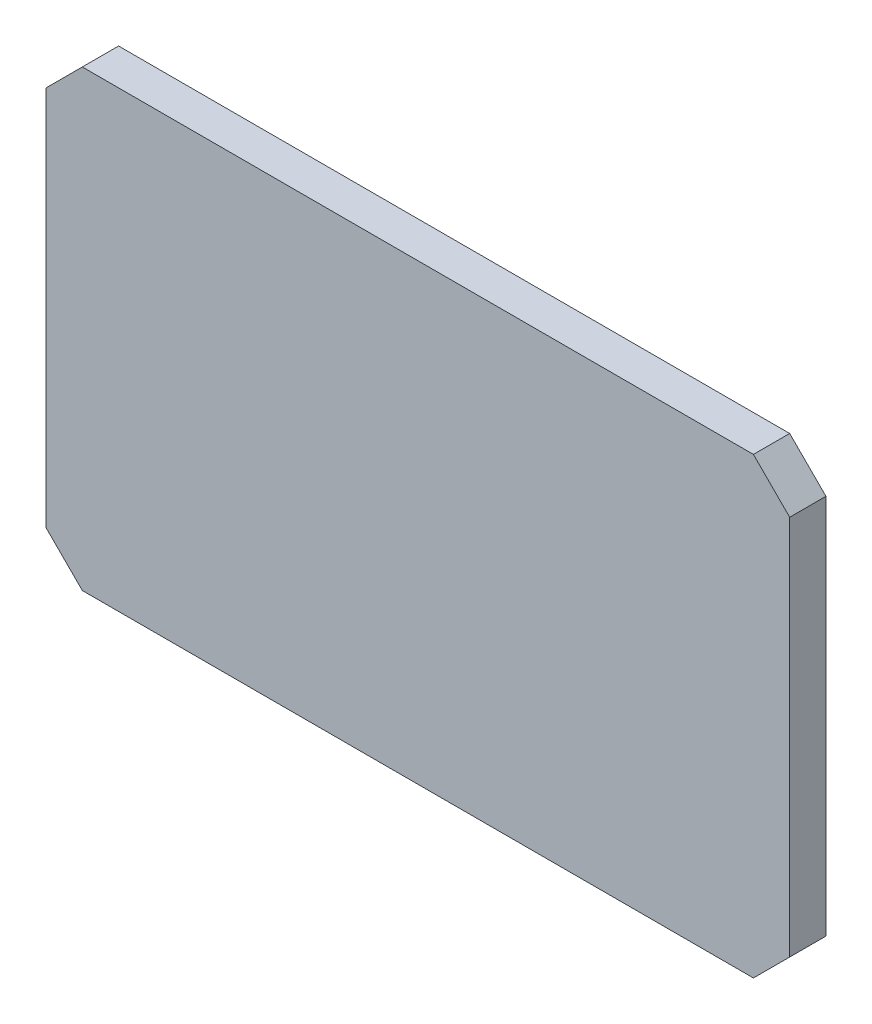
ISO-10303-21;
HEADER;
FILE_DESCRIPTION(('STEP AP214'),'2;1');
FILE_NAME('part.step','',(''),(''),'','','');
FILE_SCHEMA(('AUTOMOTIVE_DESIGN { 1 0 10303 214 1 1 1 1 }'));
ENDSEC;
DATA;
#1=APPLICATION_CONTEXT('core data for automotive mechanical design processes');
#2=APPLICATION_PROTOCOL_DEFINITION('international standard','automotive_design',2000,#1);
#3=PRODUCT_CONTEXT('',#1,'mechanical');
#4=PRODUCT('Part','Part','',(#3));
#5=PRODUCT_RELATED_PRODUCT_CATEGORY('part','',(#4));
#6=PRODUCT_DEFINITION_FORMATION('','',#4);
#7=PRODUCT_DEFINITION_CONTEXT('part definition',#1,'design');
#8=PRODUCT_DEFINITION('design','',#6,#7);
#9=PRODUCT_DEFINITION_SHAPE('','',#8);
#10=(LENGTH_UNIT() NAMED_UNIT(*) SI_UNIT(.MILLI.,.METRE.));
#11=(NAMED_UNIT(*) PLANE_ANGLE_UNIT() SI_UNIT($,.RADIAN.));
#12=(NAMED_UNIT(*) SI_UNIT($,.STERADIAN.) SOLID_ANGLE_UNIT());
#13=UNCERTAINTY_MEASURE_WITH_UNIT(LENGTH_MEASURE(1.E-05),#10,'distance_accuracy_value','');
#14=(GEOMETRIC_REPRESENTATION_CONTEXT(3) GLOBAL_UNCERTAINTY_ASSIGNED_CONTEXT((#13)) GLOBAL_UNIT_ASSIGNED_CONTEXT((#10,
#11,#12)) REPRESENTATION_CONTEXT('',''));
#15=CARTESIAN_POINT('',(0.,0.,0.));
#16=DIRECTION('',(0.,0.,1.));
#17=DIRECTION('',(1.,0.,0.));
#18=AXIS2_PLACEMENT_3D('',#15,#16,#17);
#19=CARTESIAN_POINT('',(0.,0.,0.));
#20=DIRECTION('',(0.,0.,-1.));
#21=DIRECTION('',(-1.,0.,0.));
#22=AXIS2_PLACEMENT_3D('',#19,#20,#21);
#23=PLANE('',#22);
#24=DIRECTION('',(-0.707106781186547,-0.707106781186547,0.));
#25=VECTOR('',#24,1.);
#26=CARTESIAN_POINT('',(146.625606574043,159.719339873626,0.));
#27=LINE('',#26,#25);
#28=CARTESIAN_POINT('',(146.625606574043,159.719339873626,0.));
#29=VERTEX_POINT('',#28);
#30=CARTESIAN_POINT('',(144.625606574043,157.719339873626,0.));
#31=VERTEX_POINT('',#30);
#32=EDGE_CURVE('E142',#29,#31,#27,.T.);
#33=ORIENTED_EDGE('',*,*,#32,.F.);
#34=DIRECTION('',(-1.,0.,0.));
#35=VECTOR('',#34,1.);
#36=CARTESIAN_POINT('',(146.625606574043,159.719339873626,0.));
#37=LINE('',#36,#35);
#38=CARTESIAN_POINT('',(183.625606574043,159.719339873626,0.));
#39=VERTEX_POINT('',#38);
#40=EDGE_CURVE('E90',#39,#29,#37,.T.);
#41=ORIENTED_EDGE('',*,*,#40,.F.);
#42=DIRECTION('',(-0.707106781186547,0.707106781186547,0.));
#43=VECTOR('',#42,1.);
#44=CARTESIAN_POINT('',(183.625606574043,159.719339873626,0.));
#45=LINE('',#44,#43);
#46=CARTESIAN_POINT('',(185.625606574043,157.719339873626,0.));
#47=VERTEX_POINT('',#46);
#48=EDGE_CURVE('E155',#47,#39,#45,.T.);
#49=ORIENTED_EDGE('',*,*,#48,.F.);
#50=DIRECTION('',(0.,1.,0.));
#51=VECTOR('',#50,1.);
#52=CARTESIAN_POINT('',(185.625606574043,157.719339873626,0.));
#53=LINE('',#52,#51);
#54=CARTESIAN_POINT('',(185.625606574043,136.719339873626,0.));
#55=VERTEX_POINT('',#54);
#56=EDGE_CURVE('E130',#55,#47,#53,.T.);
#57=ORIENTED_EDGE('',*,*,#56,.F.);
#58=DIRECTION('',(0.707106781186547,0.707106781186547,0.));
#59=VECTOR('',#58,1.);
#60=CARTESIAN_POINT('',(183.625606574043,134.719339873626,0.));
#61=LINE('',#60,#59);
#62=CARTESIAN_POINT('',(183.625606574043,134.719339873626,0.));
#63=VERTEX_POINT('',#62);
#64=EDGE_CURVE('E152',#63,#55,#61,.T.);
#65=ORIENTED_EDGE('',*,*,#64,.F.);
#66=DIRECTION('',(1.,0.,0.));
#67=VECTOR('',#66,1.);
#68=CARTESIAN_POINT('',(183.625606574043,134.719339873626,0.));
#69=LINE('',#68,#67);
#70=CARTESIAN_POINT('',(146.625606574043,134.719339873626,0.));
#71=VERTEX_POINT('',#70);
#72=EDGE_CURVE('E150',#71,#63,#69,.T.);
#73=ORIENTED_EDGE('',*,*,#72,.F.);
#74=DIRECTION('',(0.707106781186547,-0.707106781186547,0.));
#75=VECTOR('',#74,1.);
#76=CARTESIAN_POINT('',(146.625606574043,134.719339873626,0.));
#77=LINE('',#76,#75);
#78=CARTESIAN_POINT('',(144.625606574043,136.719339873626,0.));
#79=VERTEX_POINT('',#78);
#80=EDGE_CURVE('E148',#79,#71,#77,.T.);
#81=ORIENTED_EDGE('',*,*,#80,.F.);
#82=DIRECTION('',(0.,-1.,0.));
#83=VECTOR('',#82,1.);
#84=CARTESIAN_POINT('',(144.625606574043,136.719339873626,0.));
#85=LINE('',#84,#83);
#86=EDGE_CURVE('E145',#31,#79,#85,.T.);
#87=ORIENTED_EDGE('',*,*,#86,.F.);
#88=EDGE_LOOP('',(#33,#41,#49,#57,#65,#73,#81,#87));
#89=FACE_BOUND('',#88,.T.);
#90=DIRECTION('',(0.,1.,0.));
#91=VECTOR('',#90,1.);
#92=CARTESIAN_POINT('',(183.985590548901,149.719355145065,0.));
#93=LINE('',#92,#91);
#94=CARTESIAN_POINT('',(183.985590548901,144.719355145065,0.));
#95=VERTEX_POINT('',#94);
#96=CARTESIAN_POINT('',(183.985590548901,149.719355145065,0.));
#97=VERTEX_POINT('',#96);
#98=EDGE_CURVE('E231',#95,#97,#93,.T.);
#99=ORIENTED_EDGE('',*,*,#98,.T.);
#100=CARTESIAN_POINT('',(182.485590548901,149.719355145065,0.));
#101=DIRECTION('',(0.,0.,1.));
#102=DIRECTION('',(1.,0.,0.));
#103=AXIS2_PLACEMENT_3D('',#100,#101,#102);
#104=CIRCLE('',#103,1.5);
#105=CARTESIAN_POINT('',(180.985590548901,149.719355145065,0.));
#106=VERTEX_POINT('',#105);
#107=EDGE_CURVE('E48',#97,#106,#104,.T.);
#108=ORIENTED_EDGE('',*,*,#107,.T.);
#109=DIRECTION('',(0.,-1.,0.));
#110=VECTOR('',#109,1.);
#111=CARTESIAN_POINT('',(180.985590548901,149.719355145065,0.));
#112=LINE('',#111,#110);
#113=CARTESIAN_POINT('',(180.985590548901,148.219355145065,0.));
#114=VERTEX_POINT('',#113);
#115=EDGE_CURVE('E268',#106,#114,#112,.T.);
#116=ORIENTED_EDGE('',*,*,#115,.T.);
#117=DIRECTION('',(-1.,0.,0.));
#118=VECTOR('',#117,1.);
#119=CARTESIAN_POINT('',(180.985590548901,148.219355145065,0.));
#120=LINE('',#119,#118);
#121=CARTESIAN_POINT('',(172.836292086196,148.219355145065,0.));
#122=VERTEX_POINT('',#121);
#123=EDGE_CURVE('E265',#114,#122,#120,.T.);
#124=ORIENTED_EDGE('',*,*,#123,.T.);
#125=DIRECTION('',(-0.737764184719389,0.675058521718921,0.));
#126=VECTOR('',#125,1.);
#127=CARTESIAN_POINT('',(168.451135032468,152.23179936438,0.));
#128=LINE('',#127,#126);
#129=CARTESIAN_POINT('',(168.451135032468,152.23179936438,0.));
#130=VERTEX_POINT('',#129);
#131=EDGE_CURVE('E262',#122,#130,#128,.T.);
#132=ORIENTED_EDGE('',*,*,#131,.T.);
#133=CARTESIAN_POINT('',(164.985590548901,148.938754325619,0.));
#134=DIRECTION('',(0.,0.,1.));
#135=DIRECTION('',(1.,0.,0.));
#136=AXIS2_PLACEMENT_3D('',#133,#134,#135);
#137=CIRCLE('',#136,4.7806008194466);
#138=CARTESIAN_POINT('',(161.520046065334,152.23179936438,0.));
#139=VERTEX_POINT('',#138);
#140=EDGE_CURVE('E259',#130,#139,#137,.T.);
#141=ORIENTED_EDGE('',*,*,#140,.T.);
#142=DIRECTION('',(-0.73774054251227,-0.675084359123881,0.));
#143=VECTOR('',#142,1.);
#144=CARTESIAN_POINT('',(161.520046065334,152.23179936438,0.));
#145=LINE('',#144,#143);
#146=CARTESIAN_POINT('',(156.87340764606,147.979799184651,0.));
#147=VERTEX_POINT('',#146);
#148=EDGE_CURVE('E256',#139,#147,#145,.T.);
#149=ORIENTED_EDGE('',*,*,#148,.T.);
#150=CARTESIAN_POINT('',(157.425050468961,147.219355145065,0.));
#151=DIRECTION('',(0.,0.,1.));
#152=DIRECTION('',(1.,0.,0.));
#153=AXIS2_PLACEMENT_3D('',#150,#151,#152);
#154=CIRCLE('',#153,0.93945992006001);
#155=CARTESIAN_POINT('',(156.836640899769,146.48698971696,0.));
#156=VERTEX_POINT('',#155);
#157=EDGE_CURVE('E253',#147,#156,#154,.T.);
#158=ORIENTED_EDGE('',*,*,#157,.T.);
#159=DIRECTION('',(0.7381941598582,-0.674588305821592,0.));
#160=VECTOR('',#159,1.);
#161=CARTESIAN_POINT('',(161.504288753549,142.2215256574,0.));
#162=LINE('',#161,#160);
#163=CARTESIAN_POINT('',(161.504288753549,142.2215256574,0.));
#164=VERTEX_POINT('',#163);
#165=EDGE_CURVE('E250',#156,#164,#162,.T.);
#166=ORIENTED_EDGE('',*,*,#165,.T.);
#167=CARTESIAN_POINT('',(164.985590548901,145.497908114405,0.));
#168=DIRECTION('',(0.,0.,1.));
#169=DIRECTION('',(1.,0.,0.));
#170=AXIS2_PLACEMENT_3D('',#167,#168,#169);
#171=CIRCLE('',#170,4.78060081944658);
#172=CARTESIAN_POINT('',(168.466892344253,142.2215256574,0.));
#173=VERTEX_POINT('',#172);
#174=EDGE_CURVE('E247',#164,#173,#171,.T.);
#175=ORIENTED_EDGE('',*,*,#174,.T.);
#176=DIRECTION('',(0.738224136315598,0.674555501468256,0.));
#177=VECTOR('',#176,1.);
#178=CARTESIAN_POINT('',(168.466892344253,142.2215256574,0.));
#179=LINE('',#178,#177);
#180=CARTESIAN_POINT('',(172.842061198773,146.219355145065,0.));
#181=VERTEX_POINT('',#180);
#182=EDGE_CURVE('E244',#173,#181,#179,.T.);
#183=ORIENTED_EDGE('',*,*,#182,.T.);
#184=DIRECTION('',(1.,0.,0.));
#185=VECTOR('',#184,1.);
#186=CARTESIAN_POINT('',(180.985590548901,146.219355145065,0.));
#187=LINE('',#186,#185);
#188=CARTESIAN_POINT('',(180.985590548901,146.219355145065,0.));
#189=VERTEX_POINT('',#188);
#190=EDGE_CURVE('E241',#181,#189,#187,.T.);
#191=ORIENTED_EDGE('',*,*,#190,.T.);
#192=DIRECTION('',(0.,-1.,0.));
#193=VECTOR('',#192,1.);
#194=CARTESIAN_POINT('',(180.985590548901,146.219355145065,0.));
#195=LINE('',#194,#193);
#196=CARTESIAN_POINT('',(180.985590548901,144.719355145065,0.));
#197=VERTEX_POINT('',#196);
#198=EDGE_CURVE('E238',#189,#197,#195,.T.);
#199=ORIENTED_EDGE('',*,*,#198,.T.);
#200=CARTESIAN_POINT('',(182.485590548901,144.719355145065,0.));
#201=DIRECTION('',(0.,0.,1.));
#202=DIRECTION('',(1.,0.,0.));
#203=AXIS2_PLACEMENT_3D('',#200,#201,#202);
#204=CIRCLE('',#203,1.5);
#205=EDGE_CURVE('E235',#197,#95,#204,.T.);
#206=ORIENTED_EDGE('',*,*,#205,.T.);
#207=EDGE_LOOP('',(#99,#108,#116,#124,#132,#141,#149,#158,#166,#175,#183,#191,#199,#206));
#208=FACE_BOUND('',#207,.T.);
#209=ADVANCED_FACE('F33',(#89,#208),#23,.T.);
#210=CARTESIAN_POINT('',(146.625606574043,159.719339873626,2.));
#211=DIRECTION('',(0.707106781186547,-0.707106781186547,0.));
#212=DIRECTION('',(0.707106781186548,0.707106781186548,0.));
#213=AXIS2_PLACEMENT_3D('',#210,#211,#212);
#214=PLANE('',#213);
#215=ORIENTED_EDGE('',*,*,#32,.T.);
#216=DIRECTION('',(0.,0.,-1.));
#217=VECTOR('',#216,1.);
#218=CARTESIAN_POINT('',(144.625606574043,157.719339873626,2.));
#219=LINE('',#218,#217);
#220=CARTESIAN_POINT('',(144.625606574043,157.719339873626,2.));
#221=VERTEX_POINT('',#220);
#222=EDGE_CURVE('E11',#221,#31,#219,.T.);
#223=ORIENTED_EDGE('',*,*,#222,.F.);
#224=DIRECTION('',(-0.707106781186547,-0.707106781186547,0.));
#225=VECTOR('',#224,1.);
#226=CARTESIAN_POINT('',(146.625606574043,159.719339873626,2.));
#227=LINE('',#226,#225);
#228=CARTESIAN_POINT('',(146.625606574043,159.719339873626,2.));
#229=VERTEX_POINT('',#228);
#230=EDGE_CURVE('E158',#229,#221,#227,.T.);
#231=ORIENTED_EDGE('',*,*,#230,.F.);
#232=DIRECTION('',(0.,0.,-1.));
#233=VECTOR('',#232,1.);
#234=CARTESIAN_POINT('',(146.625606574043,159.719339873626,2.));
#235=LINE('',#234,#233);
#236=EDGE_CURVE('E138',#229,#29,#235,.T.);
#237=ORIENTED_EDGE('',*,*,#236,.T.);
#238=EDGE_LOOP('',(#215,#223,#231,#237));
#239=FACE_BOUND('',#238,.T.);
#240=ADVANCED_FACE('F35',(#239),#214,.F.);
#241=CARTESIAN_POINT('',(144.625606574043,136.719339873626,2.));
#242=DIRECTION('',(1.,0.,0.));
#243=DIRECTION('',(0.,0.,-1.));
#244=AXIS2_PLACEMENT_3D('',#241,#242,#243);
#245=PLANE('',#244);
#246=ORIENTED_EDGE('',*,*,#86,.T.);
#247=DIRECTION('',(0.,0.,-1.));
#248=VECTOR('',#247,1.);
#249=CARTESIAN_POINT('',(144.625606574043,136.719339873626,2.));
#250=LINE('',#249,#248);
#251=CARTESIAN_POINT('',(144.625606574043,136.719339873626,2.));
#252=VERTEX_POINT('',#251);
#253=EDGE_CURVE('E41',#252,#79,#250,.T.);
#254=ORIENTED_EDGE('',*,*,#253,.F.);
#255=DIRECTION('',(0.,-1.,0.));
#256=VECTOR('',#255,1.);
#257=CARTESIAN_POINT('',(144.625606574043,136.719339873626,2.));
#258=LINE('',#257,#256);
#259=EDGE_CURVE('E98',#221,#252,#258,.T.);
#260=ORIENTED_EDGE('',*,*,#259,.F.);
#261=ORIENTED_EDGE('',*,*,#222,.T.);
#262=EDGE_LOOP('',(#246,#254,#260,#261));
#263=FACE_BOUND('',#262,.T.);
#264=ADVANCED_FACE('F443',(#263),#245,.F.);
#265=CARTESIAN_POINT('',(146.625606574043,134.719339873626,2.));
#266=DIRECTION('',(0.707106781186547,0.707106781186547,0.));
#267=DIRECTION('',(-0.707106781186548,0.707106781186548,0.));
#268=AXIS2_PLACEMENT_3D('',#265,#266,#267);
#269=PLANE('',#268);
#270=ORIENTED_EDGE('',*,*,#80,.T.);
#271=DIRECTION('',(0.,0.,-1.));
#272=VECTOR('',#271,1.);
#273=CARTESIAN_POINT('',(146.625606574043,134.719339873626,2.));
#274=LINE('',#273,#272);
#275=CARTESIAN_POINT('',(146.625606574043,134.719339873626,2.));
#276=VERTEX_POINT('',#275);
#277=EDGE_CURVE('E165',#276,#71,#274,.T.);
#278=ORIENTED_EDGE('',*,*,#277,.F.);
#279=DIRECTION('',(0.707106781186547,-0.707106781186547,0.));
#280=VECTOR('',#279,1.);
#281=CARTESIAN_POINT('',(146.625606574043,134.719339873626,2.));
#282=LINE('',#281,#280);
#283=EDGE_CURVE('E173',#252,#276,#282,.T.);
#284=ORIENTED_EDGE('',*,*,#283,.F.);
#285=ORIENTED_EDGE('',*,*,#253,.T.);
#286=EDGE_LOOP('',(#270,#278,#284,#285));
#287=FACE_BOUND('',#286,.T.);
#288=ADVANCED_FACE('F171',(#287),#269,.F.);
#289=CARTESIAN_POINT('',(183.625606574043,134.719339873626,2.));
#290=DIRECTION('',(0.,1.,0.));
#291=DIRECTION('',(0.,0.,1.));
#292=AXIS2_PLACEMENT_3D('',#289,#290,#291);
#293=PLANE('',#292);
#294=ORIENTED_EDGE('',*,*,#72,.T.);
#295=DIRECTION('',(0.,0.,-1.));
#296=VECTOR('',#295,1.);
#297=CARTESIAN_POINT('',(183.625606574043,134.719339873626,2.));
#298=LINE('',#297,#296);
#299=CARTESIAN_POINT('',(183.625606574043,134.719339873626,2.));
#300=VERTEX_POINT('',#299);
#301=EDGE_CURVE('E162',#300,#63,#298,.T.);
#302=ORIENTED_EDGE('',*,*,#301,.F.);
#303=DIRECTION('',(1.,0.,0.));
#304=VECTOR('',#303,1.);
#305=CARTESIAN_POINT('',(183.625606574043,134.719339873626,2.));
#306=LINE('',#305,#304);
#307=EDGE_CURVE('E185',#276,#300,#306,.T.);
#308=ORIENTED_EDGE('',*,*,#307,.F.);
#309=ORIENTED_EDGE('',*,*,#277,.T.);
#310=EDGE_LOOP('',(#294,#302,#308,#309));
#311=FACE_BOUND('',#310,.T.);
#312=ADVANCED_FACE('F181',(#311),#293,.F.);
#313=CARTESIAN_POINT('',(183.625606574043,134.719339873626,2.));
#314=DIRECTION('',(-0.707106781186547,0.707106781186547,0.));
#315=DIRECTION('',(-0.707106781186548,-0.707106781186548,0.));
#316=AXIS2_PLACEMENT_3D('',#313,#314,#315);
#317=PLANE('',#316);
#318=ORIENTED_EDGE('',*,*,#64,.T.);
#319=DIRECTION('',(0.,0.,-1.));
#320=VECTOR('',#319,1.);
#321=CARTESIAN_POINT('',(185.625606574043,136.719339873626,2.));
#322=LINE('',#321,#320);
#323=CARTESIAN_POINT('',(185.625606574043,136.719339873626,2.));
#324=VERTEX_POINT('',#323);
#325=EDGE_CURVE('E133',#324,#55,#322,.T.);
#326=ORIENTED_EDGE('',*,*,#325,.F.);
#327=DIRECTION('',(0.707106781186547,0.707106781186547,0.));
#328=VECTOR('',#327,1.);
#329=CARTESIAN_POINT('',(183.625606574043,134.719339873626,2.));
#330=LINE('',#329,#328);
#331=EDGE_CURVE('E121',#300,#324,#330,.T.);
#332=ORIENTED_EDGE('',*,*,#331,.F.);
#333=ORIENTED_EDGE('',*,*,#301,.T.);
#334=EDGE_LOOP('',(#318,#326,#332,#333));
#335=FACE_BOUND('',#334,.T.);
#336=ADVANCED_FACE('F184',(#335),#317,.F.);
#337=CARTESIAN_POINT('',(185.625606574043,157.719339873626,2.));
#338=DIRECTION('',(-1.,0.,0.));
#339=DIRECTION('',(0.,0.,1.));
#340=AXIS2_PLACEMENT_3D('',#337,#338,#339);
#341=PLANE('',#340);
#342=ORIENTED_EDGE('',*,*,#56,.T.);
#343=DIRECTION('',(0.,0.,-1.));
#344=VECTOR('',#343,1.);
#345=CARTESIAN_POINT('',(185.625606574043,157.719339873626,2.));
#346=LINE('',#345,#344);
#347=CARTESIAN_POINT('',(185.625606574043,157.719339873626,2.));
#348=VERTEX_POINT('',#347);
#349=EDGE_CURVE('E127',#348,#47,#346,.T.);
#350=ORIENTED_EDGE('',*,*,#349,.F.);
#351=DIRECTION('',(0.,1.,0.));
#352=VECTOR('',#351,1.);
#353=CARTESIAN_POINT('',(185.625606574043,157.719339873626,2.));
#354=LINE('',#353,#352);
#355=EDGE_CURVE('E114',#324,#348,#354,.T.);
#356=ORIENTED_EDGE('',*,*,#355,.F.);
#357=ORIENTED_EDGE('',*,*,#325,.T.);
#358=EDGE_LOOP('',(#342,#350,#356,#357));
#359=FACE_BOUND('',#358,.T.);
#360=ADVANCED_FACE('F128',(#359),#341,.F.);
#361=CARTESIAN_POINT('',(183.625606574043,159.719339873626,2.));
#362=DIRECTION('',(-0.707106781186547,-0.707106781186547,0.));
#363=DIRECTION('',(0.707106781186548,-0.707106781186548,0.));
#364=AXIS2_PLACEMENT_3D('',#361,#362,#363);
#365=PLANE('',#364);
#366=ORIENTED_EDGE('',*,*,#48,.T.);
#367=DIRECTION('',(0.,0.,-1.));
#368=VECTOR('',#367,1.);
#369=CARTESIAN_POINT('',(183.625606574043,159.719339873626,2.));
#370=LINE('',#369,#368);
#371=CARTESIAN_POINT('',(183.625606574043,159.719339873626,2.));
#372=VERTEX_POINT('',#371);
#373=EDGE_CURVE('E134',#372,#39,#370,.T.);
#374=ORIENTED_EDGE('',*,*,#373,.F.);
#375=DIRECTION('',(-0.707106781186547,0.707106781186547,0.));
#376=VECTOR('',#375,1.);
#377=CARTESIAN_POINT('',(183.625606574043,159.719339873626,2.));
#378=LINE('',#377,#376);
#379=EDGE_CURVE('E118',#348,#372,#378,.T.);
#380=ORIENTED_EDGE('',*,*,#379,.F.);
#381=ORIENTED_EDGE('',*,*,#349,.T.);
#382=EDGE_LOOP('',(#366,#374,#380,#381));
#383=FACE_BOUND('',#382,.T.);
#384=ADVANCED_FACE('F136',(#383),#365,.F.);
#385=CARTESIAN_POINT('',(146.625606574043,159.719339873626,2.));
#386=DIRECTION('',(0.,-1.,0.));
#387=DIRECTION('',(0.,0.,-1.));
#388=AXIS2_PLACEMENT_3D('',#385,#386,#387);
#389=PLANE('',#388);
#390=ORIENTED_EDGE('',*,*,#40,.T.);
#391=ORIENTED_EDGE('',*,*,#236,.F.);
#392=DIRECTION('',(-1.,0.,0.));
#393=VECTOR('',#392,1.);
#394=CARTESIAN_POINT('',(146.625606574043,159.719339873626,2.));
#395=LINE('',#394,#393);
#396=EDGE_CURVE('E57',#372,#229,#395,.T.);
#397=ORIENTED_EDGE('',*,*,#396,.F.);
#398=ORIENTED_EDGE('',*,*,#373,.T.);
#399=EDGE_LOOP('',(#390,#391,#397,#398));
#400=FACE_BOUND('',#399,.T.);
#401=ADVANCED_FACE('F448',(#400),#389,.F.);
#402=CARTESIAN_POINT('',(0.,0.,2.));
#403=DIRECTION('',(0.,0.,-1.));
#404=DIRECTION('',(-1.,0.,0.));
#405=AXIS2_PLACEMENT_3D('',#402,#403,#404);
#406=PLANE('',#405);
#407=ORIENTED_EDGE('',*,*,#230,.T.);
#408=ORIENTED_EDGE('',*,*,#259,.T.);
#409=ORIENTED_EDGE('',*,*,#283,.T.);
#410=ORIENTED_EDGE('',*,*,#307,.T.);
#411=ORIENTED_EDGE('',*,*,#331,.T.);
#412=ORIENTED_EDGE('',*,*,#355,.T.);
#413=ORIENTED_EDGE('',*,*,#379,.T.);
#414=ORIENTED_EDGE('',*,*,#396,.T.);
#415=EDGE_LOOP('',(#407,#408,#409,#410,#411,#412,#413,#414));
#416=FACE_BOUND('',#415,.T.);
#417=ADVANCED_FACE('F116',(#416),#406,.F.);
#418=CARTESIAN_POINT('',(182.485590548901,149.719355145065,1.));
#419=DIRECTION('',(0.,0.,-1.));
#420=DIRECTION('',(-1.,0.,0.));
#421=AXIS2_PLACEMENT_3D('',#418,#419,#420);
#422=CYLINDRICAL_SURFACE('',#421,1.5);
#423=ORIENTED_EDGE('',*,*,#107,.F.);
#424=DIRECTION('',(0.,0.,-1.));
#425=VECTOR('',#424,1.);
#426=CARTESIAN_POINT('',(183.985590548901,149.719355145065,1.));
#427=LINE('',#426,#425);
#428=CARTESIAN_POINT('',(183.985590548901,149.719355145065,1.));
#429=VERTEX_POINT('',#428);
#430=EDGE_CURVE('E228',#429,#97,#427,.T.);
#431=ORIENTED_EDGE('',*,*,#430,.F.);
#432=CARTESIAN_POINT('',(182.485590548901,149.719355145065,1.));
#433=DIRECTION('',(0.,0.,1.));
#434=DIRECTION('',(1.,0.,0.));
#435=AXIS2_PLACEMENT_3D('',#432,#433,#434);
#436=CIRCLE('',#435,1.5);
#437=CARTESIAN_POINT('',(180.985590548901,149.719355145065,1.));
#438=VERTEX_POINT('',#437);
#439=EDGE_CURVE('E234',#429,#438,#436,.T.);
#440=ORIENTED_EDGE('',*,*,#439,.T.);
#441=DIRECTION('',(0.,0.,-1.));
#442=VECTOR('',#441,1.);
#443=CARTESIAN_POINT('',(180.985590548901,149.719355145065,1.));
#444=LINE('',#443,#442);
#445=EDGE_CURVE('E146',#438,#106,#444,.T.);
#446=ORIENTED_EDGE('',*,*,#445,.T.);
#447=EDGE_LOOP('',(#423,#431,#440,#446));
#448=FACE_BOUND('',#447,.T.);
#449=ADVANCED_FACE('F314',(#448),#422,.F.);
#450=CARTESIAN_POINT('',(180.985590548901,149.719355145065,1.));
#451=DIRECTION('',(1.,0.,0.));
#452=DIRECTION('',(0.,0.,-1.));
#453=AXIS2_PLACEMENT_3D('',#450,#451,#452);
#454=PLANE('',#453);
#455=ORIENTED_EDGE('',*,*,#115,.F.);
#456=ORIENTED_EDGE('',*,*,#445,.F.);
#457=DIRECTION('',(0.,-1.,0.));
#458=VECTOR('',#457,1.);
#459=CARTESIAN_POINT('',(180.985590548901,149.719355145065,1.));
#460=LINE('',#459,#458);
#461=CARTESIAN_POINT('',(180.985590548901,148.219355145065,1.));
#462=VERTEX_POINT('',#461);
#463=EDGE_CURVE('E307',#438,#462,#460,.T.);
#464=ORIENTED_EDGE('',*,*,#463,.T.);
#465=DIRECTION('',(0.,0.,-1.));
#466=VECTOR('',#465,1.);
#467=CARTESIAN_POINT('',(180.985590548901,148.219355145065,1.));
#468=LINE('',#467,#466);
#469=EDGE_CURVE('E192',#462,#114,#468,.T.);
#470=ORIENTED_EDGE('',*,*,#469,.T.);
#471=EDGE_LOOP('',(#455,#456,#464,#470));
#472=FACE_BOUND('',#471,.T.);
#473=ADVANCED_FACE('F323',(#472),#454,.T.);
#474=CARTESIAN_POINT('',(180.985590548901,148.219355145065,1.));
#475=DIRECTION('',(0.,-1.,0.));
#476=DIRECTION('',(0.,0.,-1.));
#477=AXIS2_PLACEMENT_3D('',#474,#475,#476);
#478=PLANE('',#477);
#479=ORIENTED_EDGE('',*,*,#123,.F.);
#480=ORIENTED_EDGE('',*,*,#469,.F.);
#481=DIRECTION('',(-1.,0.,0.));
#482=VECTOR('',#481,1.);
#483=CARTESIAN_POINT('',(180.985590548901,148.219355145065,1.));
#484=LINE('',#483,#482);
#485=CARTESIAN_POINT('',(172.836292086196,148.219355145065,1.));
#486=VERTEX_POINT('',#485);
#487=EDGE_CURVE('E304',#462,#486,#484,.T.);
#488=ORIENTED_EDGE('',*,*,#487,.T.);
#489=DIRECTION('',(0.,0.,-1.));
#490=VECTOR('',#489,1.);
#491=CARTESIAN_POINT('',(172.836292086196,148.219355145065,1.));
#492=LINE('',#491,#490);
#493=EDGE_CURVE('E195',#486,#122,#492,.T.);
#494=ORIENTED_EDGE('',*,*,#493,.T.);
#495=EDGE_LOOP('',(#479,#480,#488,#494));
#496=FACE_BOUND('',#495,.T.);
#497=ADVANCED_FACE('F394',(#496),#478,.T.);
#498=CARTESIAN_POINT('',(168.451135032468,152.23179936438,1.));
#499=DIRECTION('',(-0.675058521718921,-0.737764184719389,0.));
#500=DIRECTION('',(0.737764184719389,-0.675058521718921,0.));
#501=AXIS2_PLACEMENT_3D('',#498,#499,#500);
#502=PLANE('',#501);
#503=ORIENTED_EDGE('',*,*,#131,.F.);
#504=ORIENTED_EDGE('',*,*,#493,.F.);
#505=DIRECTION('',(-0.737764184719389,0.675058521718921,0.));
#506=VECTOR('',#505,1.);
#507=CARTESIAN_POINT('',(168.451135032468,152.23179936438,1.));
#508=LINE('',#507,#506);
#509=CARTESIAN_POINT('',(168.451135032468,152.23179936438,1.));
#510=VERTEX_POINT('',#509);
#511=EDGE_CURVE('E301',#486,#510,#508,.T.);
#512=ORIENTED_EDGE('',*,*,#511,.T.);
#513=DIRECTION('',(0.,0.,-1.));
#514=VECTOR('',#513,1.);
#515=CARTESIAN_POINT('',(168.451135032468,152.23179936438,1.));
#516=LINE('',#515,#514);
#517=EDGE_CURVE('E198',#510,#130,#516,.T.);
#518=ORIENTED_EDGE('',*,*,#517,.T.);
#519=EDGE_LOOP('',(#503,#504,#512,#518));
#520=FACE_BOUND('',#519,.T.);
#521=ADVANCED_FACE('F398',(#520),#502,.T.);
#522=CARTESIAN_POINT('',(164.985590548901,148.938754325619,1.));
#523=DIRECTION('',(0.,0.,-1.));
#524=DIRECTION('',(-1.,0.,0.));
#525=AXIS2_PLACEMENT_3D('',#522,#523,#524);
#526=CYLINDRICAL_SURFACE('',#525,4.7806008194466);
#527=ORIENTED_EDGE('',*,*,#140,.F.);
#528=ORIENTED_EDGE('',*,*,#517,.F.);
#529=CARTESIAN_POINT('',(164.985590548901,148.938754325619,1.));
#530=DIRECTION('',(0.,0.,1.));
#531=DIRECTION('',(1.,0.,0.));
#532=AXIS2_PLACEMENT_3D('',#529,#530,#531);
#533=CIRCLE('',#532,4.7806008194466);
#534=CARTESIAN_POINT('',(161.520046065334,152.23179936438,1.));
#535=VERTEX_POINT('',#534);
#536=EDGE_CURVE('E298',#510,#535,#533,.T.);
#537=ORIENTED_EDGE('',*,*,#536,.T.);
#538=DIRECTION('',(0.,0.,-1.));
#539=VECTOR('',#538,1.);
#540=CARTESIAN_POINT('',(161.520046065334,152.23179936438,1.));
#541=LINE('',#540,#539);
#542=EDGE_CURVE('E201',#535,#139,#541,.T.);
#543=ORIENTED_EDGE('',*,*,#542,.T.);
#544=EDGE_LOOP('',(#527,#528,#537,#543));
#545=FACE_BOUND('',#544,.T.);
#546=ADVANCED_FACE('F406',(#545),#526,.F.);
#547=CARTESIAN_POINT('',(161.520046065334,152.23179936438,1.));
#548=DIRECTION('',(0.675084359123882,-0.73774054251227,0.));
#549=DIRECTION('',(0.73774054251227,0.675084359123882,0.));
#550=AXIS2_PLACEMENT_3D('',#547,#548,#549);
#551=PLANE('',#550);
#552=ORIENTED_EDGE('',*,*,#148,.F.);
#553=ORIENTED_EDGE('',*,*,#542,.F.);
#554=DIRECTION('',(-0.73774054251227,-0.675084359123881,0.));
#555=VECTOR('',#554,1.);
#556=CARTESIAN_POINT('',(161.520046065334,152.23179936438,1.));
#557=LINE('',#556,#555);
#558=CARTESIAN_POINT('',(156.87340764606,147.979799184651,1.));
#559=VERTEX_POINT('',#558);
#560=EDGE_CURVE('E295',#535,#559,#557,.T.);
#561=ORIENTED_EDGE('',*,*,#560,.T.);
#562=DIRECTION('',(0.,0.,-1.));
#563=VECTOR('',#562,1.);
#564=CARTESIAN_POINT('',(156.87340764606,147.979799184651,1.));
#565=LINE('',#564,#563);
#566=EDGE_CURVE('E204',#559,#147,#565,.T.);
#567=ORIENTED_EDGE('',*,*,#566,.T.);
#568=EDGE_LOOP('',(#552,#553,#561,#567));
#569=FACE_BOUND('',#568,.T.);
#570=ADVANCED_FACE('F409',(#569),#551,.T.);
#571=CARTESIAN_POINT('',(157.425050468961,147.219355145065,1.));
#572=DIRECTION('',(0.,0.,-1.));
#573=DIRECTION('',(-1.,0.,0.));
#574=AXIS2_PLACEMENT_3D('',#571,#572,#573);
#575=CYLINDRICAL_SURFACE('',#574,0.93945992006001);
#576=ORIENTED_EDGE('',*,*,#157,.F.);
#577=ORIENTED_EDGE('',*,*,#566,.F.);
#578=CARTESIAN_POINT('',(157.425050468961,147.219355145065,1.));
#579=DIRECTION('',(0.,0.,1.));
#580=DIRECTION('',(1.,0.,0.));
#581=AXIS2_PLACEMENT_3D('',#578,#579,#580);
#582=CIRCLE('',#581,0.93945992006001);
#583=CARTESIAN_POINT('',(156.836640899769,146.48698971696,1.));
#584=VERTEX_POINT('',#583);
#585=EDGE_CURVE('E292',#559,#584,#582,.T.);
#586=ORIENTED_EDGE('',*,*,#585,.T.);
#587=DIRECTION('',(0.,0.,-1.));
#588=VECTOR('',#587,1.);
#589=CARTESIAN_POINT('',(156.836640899769,146.48698971696,1.));
#590=LINE('',#589,#588);
#591=EDGE_CURVE('E207',#584,#156,#590,.T.);
#592=ORIENTED_EDGE('',*,*,#591,.T.);
#593=EDGE_LOOP('',(#576,#577,#586,#592));
#594=FACE_BOUND('',#593,.T.);
#595=ADVANCED_FACE('F414',(#594),#575,.F.);
#596=CARTESIAN_POINT('',(161.504288753549,142.2215256574,1.));
#597=DIRECTION('',(0.674588305821592,0.7381941598582,0.));
#598=DIRECTION('',(-0.7381941598582,0.674588305821592,0.));
#599=AXIS2_PLACEMENT_3D('',#596,#597,#598);
#600=PLANE('',#599);
#601=ORIENTED_EDGE('',*,*,#165,.F.);
#602=ORIENTED_EDGE('',*,*,#591,.F.);
#603=DIRECTION('',(0.7381941598582,-0.674588305821592,0.));
#604=VECTOR('',#603,1.);
#605=CARTESIAN_POINT('',(161.504288753549,142.2215256574,1.));
#606=LINE('',#605,#604);
#607=CARTESIAN_POINT('',(161.504288753549,142.2215256574,1.));
#608=VERTEX_POINT('',#607);
#609=EDGE_CURVE('E289',#584,#608,#606,.T.);
#610=ORIENTED_EDGE('',*,*,#609,.T.);
#611=DIRECTION('',(0.,0.,-1.));
#612=VECTOR('',#611,1.);
#613=CARTESIAN_POINT('',(161.504288753549,142.2215256574,1.));
#614=LINE('',#613,#612);
#615=EDGE_CURVE('E210',#608,#164,#614,.T.);
#616=ORIENTED_EDGE('',*,*,#615,.T.);
#617=EDGE_LOOP('',(#601,#602,#610,#616));
#618=FACE_BOUND('',#617,.T.);
#619=ADVANCED_FACE('F418',(#618),#600,.T.);
#620=CARTESIAN_POINT('',(164.985590548901,145.497908114405,1.));
#621=DIRECTION('',(0.,0.,-1.));
#622=DIRECTION('',(-1.,0.,0.));
#623=AXIS2_PLACEMENT_3D('',#620,#621,#622);
#624=CYLINDRICAL_SURFACE('',#623,4.78060081944658);
#625=ORIENTED_EDGE('',*,*,#174,.F.);
#626=ORIENTED_EDGE('',*,*,#615,.F.);
#627=CARTESIAN_POINT('',(164.985590548901,145.497908114405,1.));
#628=DIRECTION('',(0.,0.,1.));
#629=DIRECTION('',(1.,0.,0.));
#630=AXIS2_PLACEMENT_3D('',#627,#628,#629);
#631=CIRCLE('',#630,4.78060081944658);
#632=CARTESIAN_POINT('',(168.466892344253,142.2215256574,1.));
#633=VERTEX_POINT('',#632);
#634=EDGE_CURVE('E286',#608,#633,#631,.T.);
#635=ORIENTED_EDGE('',*,*,#634,.T.);
#636=DIRECTION('',(0.,0.,-1.));
#637=VECTOR('',#636,1.);
#638=CARTESIAN_POINT('',(168.466892344253,142.2215256574,1.));
#639=LINE('',#638,#637);
#640=EDGE_CURVE('E213',#633,#173,#639,.T.);
#641=ORIENTED_EDGE('',*,*,#640,.T.);
#642=EDGE_LOOP('',(#625,#626,#635,#641));
#643=FACE_BOUND('',#642,.T.);
#644=ADVANCED_FACE('F423',(#643),#624,.F.);
#645=CARTESIAN_POINT('',(168.466892344253,142.2215256574,1.));
#646=DIRECTION('',(-0.674555501468256,0.738224136315598,0.));
#647=DIRECTION('',(-0.738224136315598,-0.674555501468256,0.));
#648=AXIS2_PLACEMENT_3D('',#645,#646,#647);
#649=PLANE('',#648);
#650=ORIENTED_EDGE('',*,*,#182,.F.);
#651=ORIENTED_EDGE('',*,*,#640,.F.);
#652=DIRECTION('',(0.738224136315598,0.674555501468256,0.));
#653=VECTOR('',#652,1.);
#654=CARTESIAN_POINT('',(168.466892344253,142.2215256574,1.));
#655=LINE('',#654,#653);
#656=CARTESIAN_POINT('',(172.842061198773,146.219355145065,1.));
#657=VERTEX_POINT('',#656);
#658=EDGE_CURVE('E283',#633,#657,#655,.T.);
#659=ORIENTED_EDGE('',*,*,#658,.T.);
#660=DIRECTION('',(0.,0.,-1.));
#661=VECTOR('',#660,1.);
#662=CARTESIAN_POINT('',(172.842061198773,146.219355145065,1.));
#663=LINE('',#662,#661);
#664=EDGE_CURVE('E216',#657,#181,#663,.T.);
#665=ORIENTED_EDGE('',*,*,#664,.T.);
#666=EDGE_LOOP('',(#650,#651,#659,#665));
#667=FACE_BOUND('',#666,.T.);
#668=ADVANCED_FACE('F427',(#667),#649,.T.);
#669=CARTESIAN_POINT('',(180.985590548901,146.219355145065,1.));
#670=DIRECTION('',(0.,1.,0.));
#671=DIRECTION('',(0.,0.,1.));
#672=AXIS2_PLACEMENT_3D('',#669,#670,#671);
#673=PLANE('',#672);
#674=ORIENTED_EDGE('',*,*,#190,.F.);
#675=ORIENTED_EDGE('',*,*,#664,.F.);
#676=DIRECTION('',(1.,0.,0.));
#677=VECTOR('',#676,1.);
#678=CARTESIAN_POINT('',(180.985590548901,146.219355145065,1.));
#679=LINE('',#678,#677);
#680=CARTESIAN_POINT('',(180.985590548901,146.219355145065,1.));
#681=VERTEX_POINT('',#680);
#682=EDGE_CURVE('E280',#657,#681,#679,.T.);
#683=ORIENTED_EDGE('',*,*,#682,.T.);
#684=DIRECTION('',(0.,0.,-1.));
#685=VECTOR('',#684,1.);
#686=CARTESIAN_POINT('',(180.985590548901,146.219355145065,1.));
#687=LINE('',#686,#685);
#688=EDGE_CURVE('E219',#681,#189,#687,.T.);
#689=ORIENTED_EDGE('',*,*,#688,.T.);
#690=EDGE_LOOP('',(#674,#675,#683,#689));
#691=FACE_BOUND('',#690,.T.);
#692=ADVANCED_FACE('F429',(#691),#673,.T.);
#693=CARTESIAN_POINT('',(180.985590548901,146.219355145065,1.));
#694=DIRECTION('',(1.,0.,0.));
#695=DIRECTION('',(0.,0.,-1.));
#696=AXIS2_PLACEMENT_3D('',#693,#694,#695);
#697=PLANE('',#696);
#698=ORIENTED_EDGE('',*,*,#198,.F.);
#699=ORIENTED_EDGE('',*,*,#688,.F.);
#700=DIRECTION('',(0.,-1.,0.));
#701=VECTOR('',#700,1.);
#702=CARTESIAN_POINT('',(180.985590548901,146.219355145065,1.));
#703=LINE('',#702,#701);
#704=CARTESIAN_POINT('',(180.985590548901,144.719355145065,1.));
#705=VERTEX_POINT('',#704);
#706=EDGE_CURVE('E277',#681,#705,#703,.T.);
#707=ORIENTED_EDGE('',*,*,#706,.T.);
#708=DIRECTION('',(0.,0.,-1.));
#709=VECTOR('',#708,1.);
#710=CARTESIAN_POINT('',(180.985590548901,144.719355145065,1.));
#711=LINE('',#710,#709);
#712=EDGE_CURVE('E222',#705,#197,#711,.T.);
#713=ORIENTED_EDGE('',*,*,#712,.T.);
#714=EDGE_LOOP('',(#698,#699,#707,#713));
#715=FACE_BOUND('',#714,.T.);
#716=ADVANCED_FACE('F363',(#715),#697,.T.);
#717=CARTESIAN_POINT('',(182.485590548901,144.719355145065,1.));
#718=DIRECTION('',(0.,0.,-1.));
#719=DIRECTION('',(-1.,0.,0.));
#720=AXIS2_PLACEMENT_3D('',#717,#718,#719);
#721=CYLINDRICAL_SURFACE('',#720,1.5);
#722=ORIENTED_EDGE('',*,*,#205,.F.);
#723=ORIENTED_EDGE('',*,*,#712,.F.);
#724=CARTESIAN_POINT('',(182.485590548901,144.719355145065,1.));
#725=DIRECTION('',(0.,0.,1.));
#726=DIRECTION('',(1.,0.,0.));
#727=AXIS2_PLACEMENT_3D('',#724,#725,#726);
#728=CIRCLE('',#727,1.5);
#729=CARTESIAN_POINT('',(183.985590548901,144.719355145065,1.));
#730=VERTEX_POINT('',#729);
#731=EDGE_CURVE('E274',#705,#730,#728,.T.);
#732=ORIENTED_EDGE('',*,*,#731,.T.);
#733=DIRECTION('',(0.,0.,-1.));
#734=VECTOR('',#733,1.);
#735=CARTESIAN_POINT('',(183.985590548901,144.719355145065,1.));
#736=LINE('',#735,#734);
#737=EDGE_CURVE('E225',#730,#95,#736,.T.);
#738=ORIENTED_EDGE('',*,*,#737,.T.);
#739=EDGE_LOOP('',(#722,#723,#732,#738));
#740=FACE_BOUND('',#739,.T.);
#741=ADVANCED_FACE('F356',(#740),#721,.F.);
#742=CARTESIAN_POINT('',(183.985590548901,149.719355145065,1.));
#743=DIRECTION('',(-1.,0.,0.));
#744=DIRECTION('',(0.,0.,1.));
#745=AXIS2_PLACEMENT_3D('',#742,#743,#744);
#746=PLANE('',#745);
#747=ORIENTED_EDGE('',*,*,#98,.F.);
#748=ORIENTED_EDGE('',*,*,#737,.F.);
#749=DIRECTION('',(0.,1.,0.));
#750=VECTOR('',#749,1.);
#751=CARTESIAN_POINT('',(183.985590548901,149.719355145065,1.));
#752=LINE('',#751,#750);
#753=EDGE_CURVE('E230',#730,#429,#752,.T.);
#754=ORIENTED_EDGE('',*,*,#753,.T.);
#755=ORIENTED_EDGE('',*,*,#430,.T.);
#756=EDGE_LOOP('',(#747,#748,#754,#755));
#757=FACE_BOUND('',#756,.T.);
#758=ADVANCED_FACE('F360',(#757),#746,.T.);
#759=CARTESIAN_POINT('',(182.485590548901,149.719355145065,1.));
#760=DIRECTION('',(0.,0.,1.));
#761=DIRECTION('',(1.,0.,0.));
#762=AXIS2_PLACEMENT_3D('',#759,#760,#761);
#763=PLANE('',#762);
#764=ORIENTED_EDGE('',*,*,#439,.F.);
#765=ORIENTED_EDGE('',*,*,#753,.F.);
#766=ORIENTED_EDGE('',*,*,#731,.F.);
#767=ORIENTED_EDGE('',*,*,#706,.F.);
#768=ORIENTED_EDGE('',*,*,#682,.F.);
#769=ORIENTED_EDGE('',*,*,#658,.F.);
#770=ORIENTED_EDGE('',*,*,#634,.F.);
#771=ORIENTED_EDGE('',*,*,#609,.F.);
#772=ORIENTED_EDGE('',*,*,#585,.F.);
#773=ORIENTED_EDGE('',*,*,#560,.F.);
#774=ORIENTED_EDGE('',*,*,#536,.F.);
#775=ORIENTED_EDGE('',*,*,#511,.F.);
#776=ORIENTED_EDGE('',*,*,#487,.F.);
#777=ORIENTED_EDGE('',*,*,#463,.F.);
#778=EDGE_LOOP('',(#764,#765,#766,#767,#768,#769,#770,#771,#772,#773,#774,#775,#776,#777));
#779=FACE_BOUND('',#778,.T.);
#780=ADVANCED_FACE('F371',(#779),#763,.F.);
#781=CLOSED_SHELL('',(#209,#240,#264,#288,#312,#336,#360,#384,#401,#417,#449,#473,#497,#521,
#546,#570,#595,#619,#644,#668,#692,#716,#741,#758,#780));
#782=MANIFOLD_SOLID_BREP('B2',#781);
#783=ADVANCED_BREP_SHAPE_REPRESENTATION('',(#18,#782),#14);
#784=SHAPE_DEFINITION_REPRESENTATION(#9,#783);
ENDSEC;
END-ISO-10303-21;
